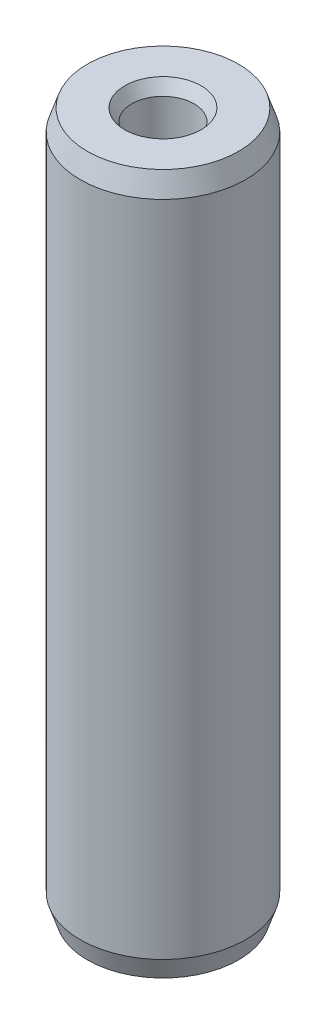
ISO-10303-21;
HEADER;
FILE_DESCRIPTION(('STEP AP214'),'2;1');
FILE_NAME('part.step','',(''),(''),'','','');
FILE_SCHEMA(('AUTOMOTIVE_DESIGN { 1 0 10303 214 1 1 1 1 }'));
ENDSEC;
DATA;
#1=APPLICATION_CONTEXT('core data for automotive mechanical design processes');
#2=APPLICATION_PROTOCOL_DEFINITION('international standard','automotive_design',2000,#1);
#3=PRODUCT_CONTEXT('',#1,'mechanical');
#4=PRODUCT('Part','Part','',(#3));
#5=PRODUCT_RELATED_PRODUCT_CATEGORY('part','',(#4));
#6=PRODUCT_DEFINITION_FORMATION('','',#4);
#7=PRODUCT_DEFINITION_CONTEXT('part definition',#1,'design');
#8=PRODUCT_DEFINITION('design','',#6,#7);
#9=PRODUCT_DEFINITION_SHAPE('','',#8);
#10=(LENGTH_UNIT() NAMED_UNIT(*) SI_UNIT(.MILLI.,.METRE.));
#11=(NAMED_UNIT(*) PLANE_ANGLE_UNIT() SI_UNIT($,.RADIAN.));
#12=(NAMED_UNIT(*) SI_UNIT($,.STERADIAN.) SOLID_ANGLE_UNIT());
#13=UNCERTAINTY_MEASURE_WITH_UNIT(LENGTH_MEASURE(1.E-05),#10,'distance_accuracy_value','');
#14=(GEOMETRIC_REPRESENTATION_CONTEXT(3) GLOBAL_UNCERTAINTY_ASSIGNED_CONTEXT((#13)) GLOBAL_UNIT_ASSIGNED_CONTEXT((#10,
#11,#12)) REPRESENTATION_CONTEXT('',''));
#15=CARTESIAN_POINT('',(0.,0.,0.));
#16=DIRECTION('',(0.,0.,1.));
#17=DIRECTION('',(1.,0.,0.));
#18=AXIS2_PLACEMENT_3D('',#15,#16,#17);
#19=CARTESIAN_POINT('',(-1.06592274227069,15.1859369307251,-1.12643595849704));
#20=DIRECTION('',(0.,-1.,0.));
#21=DIRECTION('',(0.,0.,-1.));
#22=AXIS2_PLACEMENT_3D('',#19,#20,#21);
#23=PLANE('',#22);
#24=CARTESIAN_POINT('',(-1.06592274227069,15.1859369307251,-1.12643595849704));
#25=DIRECTION('',(0.,-1.,0.));
#26=DIRECTION('',(0.,0.,-1.));
#27=AXIS2_PLACEMENT_3D('',#24,#25,#26);
#28=CIRCLE('',#27,1.3843);
#29=CARTESIAN_POINT('',(-1.06592274227069,15.1859369307251,0.257864041502961));
#30=VERTEX_POINT('',#29);
#31=EDGE_CURVE('E11',#30,#30,#28,.T.);
#32=ORIENTED_EDGE('',*,*,#31,.T.);
#33=EDGE_LOOP('',(#32));
#34=FACE_BOUND('',#33,.T.);
#35=CARTESIAN_POINT('',(-1.06592274227069,15.1859369307251,-1.12643595849704));
#36=DIRECTION('',(0.,1.,0.));
#37=DIRECTION('',(0.,0.,1.));
#38=AXIS2_PLACEMENT_3D('',#35,#36,#37);
#39=CIRCLE('',#38,2.7432);
#40=CARTESIAN_POINT('',(-1.06592274227069,15.1859369307251,1.61676404150296));
#41=VERTEX_POINT('',#40);
#42=EDGE_CURVE('E54',#41,#41,#39,.T.);
#43=ORIENTED_EDGE('',*,*,#42,.T.);
#44=EDGE_LOOP('',(#43));
#45=FACE_BOUND('',#44,.T.);
#46=ADVANCED_FACE('F16',(#34,#45),#23,.F.);
#47=CARTESIAN_POINT('',(-1.06592274227069,14.4239369307251,-1.12643595849704));
#48=DIRECTION('',(0.,-1.,0.));
#49=DIRECTION('',(0.,0.,-1.));
#50=AXIS2_PLACEMENT_3D('',#47,#48,#49);
#51=CONICAL_SURFACE('',#50,2.9972,0.321750554396645);
#52=ORIENTED_EDGE('',*,*,#42,.F.);
#53=EDGE_LOOP('',(#52));
#54=FACE_BOUND('',#53,.T.);
#55=CARTESIAN_POINT('',(-1.06592274227069,14.4239369307251,-1.12643595849704));
#56=DIRECTION('',(0.,1.,0.));
#57=DIRECTION('',(0.,0.,1.));
#58=AXIS2_PLACEMENT_3D('',#55,#56,#57);
#59=CIRCLE('',#58,2.9972);
#60=CARTESIAN_POINT('',(-1.06592274227069,14.4239369307251,1.87076404150296));
#61=VERTEX_POINT('',#60);
#62=EDGE_CURVE('E51',#61,#61,#59,.T.);
#63=ORIENTED_EDGE('',*,*,#62,.T.);
#64=EDGE_LOOP('',(#63));
#65=FACE_BOUND('',#64,.T.);
#66=ADVANCED_FACE('F75',(#54,#65),#51,.T.);
#67=CARTESIAN_POINT('',(-1.06592274227069,15.1859369307251,-1.12643595849704));
#68=DIRECTION('',(0.,1.,0.));
#69=DIRECTION('',(0.,0.,1.));
#70=AXIS2_PLACEMENT_3D('',#67,#68,#69);
#71=CYLINDRICAL_SURFACE('',#70,2.9972);
#72=ORIENTED_EDGE('',*,*,#62,.F.);
#73=EDGE_LOOP('',(#72));
#74=FACE_BOUND('',#73,.T.);
#75=CARTESIAN_POINT('',(-1.06592274227069,-9.45206306927492,-1.12643595849704));
#76=DIRECTION('',(0.,1.,0.));
#77=DIRECTION('',(0.,0.,1.));
#78=AXIS2_PLACEMENT_3D('',#75,#76,#77);
#79=CIRCLE('',#78,2.9972);
#80=CARTESIAN_POINT('',(-1.06592274227069,-9.45206306927492,1.87076404150296));
#81=VERTEX_POINT('',#80);
#82=EDGE_CURVE('E48',#81,#81,#79,.T.);
#83=ORIENTED_EDGE('',*,*,#82,.T.);
#84=EDGE_LOOP('',(#83));
#85=FACE_BOUND('',#84,.T.);
#86=ADVANCED_FACE('F81',(#74,#85),#71,.T.);
#87=CARTESIAN_POINT('',(-1.06592274227069,-10.2140630692749,-1.12643595849704));
#88=DIRECTION('',(0.,1.,0.));
#89=DIRECTION('',(0.,0.,1.));
#90=AXIS2_PLACEMENT_3D('',#87,#88,#89);
#91=CONICAL_SURFACE('',#90,2.7432,0.321750554396645);
#92=ORIENTED_EDGE('',*,*,#82,.F.);
#93=EDGE_LOOP('',(#92));
#94=FACE_BOUND('',#93,.T.);
#95=CARTESIAN_POINT('',(-1.06592274227069,-10.2140630692749,-1.12643595849704));
#96=DIRECTION('',(0.,1.,0.));
#97=DIRECTION('',(0.,0.,1.));
#98=AXIS2_PLACEMENT_3D('',#95,#96,#97);
#99=CIRCLE('',#98,2.7432);
#100=CARTESIAN_POINT('',(-1.06592274227069,-10.2140630692749,1.61676404150296));
#101=VERTEX_POINT('',#100);
#102=EDGE_CURVE('E43',#101,#101,#99,.T.);
#103=ORIENTED_EDGE('',*,*,#102,.T.);
#104=EDGE_LOOP('',(#103));
#105=FACE_BOUND('',#104,.T.);
#106=ADVANCED_FACE('F88',(#94,#105),#91,.T.);
#107=CARTESIAN_POINT('',(1.67727725772931,-10.2140630692749,-1.12643595849704));
#108=DIRECTION('',(0.,1.,0.));
#109=DIRECTION('',(0.,0.,1.));
#110=AXIS2_PLACEMENT_3D('',#107,#108,#109);
#111=PLANE('',#110);
#112=CARTESIAN_POINT('',(-1.06592274227069,-10.2140630692749,-1.12643595849704));
#113=DIRECTION('',(0.,1.,0.));
#114=DIRECTION('',(0.,0.,1.));
#115=AXIS2_PLACEMENT_3D('',#112,#113,#114);
#116=CIRCLE('',#115,1.3843);
#117=CARTESIAN_POINT('',(-1.06592274227069,-10.2140630692749,-2.51073595849704));
#118=VERTEX_POINT('',#117);
#119=EDGE_CURVE('E60',#118,#118,#116,.T.);
#120=ORIENTED_EDGE('',*,*,#119,.T.);
#121=EDGE_LOOP('',(#120));
#122=FACE_BOUND('',#121,.T.);
#123=ORIENTED_EDGE('',*,*,#102,.F.);
#124=EDGE_LOOP('',(#123));
#125=FACE_BOUND('',#124,.T.);
#126=ADVANCED_FACE('F92',(#122,#125),#111,.F.);
#127=CARTESIAN_POINT('',(-1.06592274227069,-10.2140630692749,-1.12643595849704));
#128=DIRECTION('',(0.,-1.,0.));
#129=DIRECTION('',(0.,0.,-1.));
#130=AXIS2_PLACEMENT_3D('',#127,#128,#129);
#131=CYLINDRICAL_SURFACE('',#130,1.1303);
#132=CARTESIAN_POINT('',(-1.06592274227069,-9.77412216415243,-1.12643595849704));
#133=DIRECTION('',(0.,1.,0.));
#134=DIRECTION('',(0.,0.,1.));
#135=AXIS2_PLACEMENT_3D('',#132,#133,#134);
#136=CIRCLE('',#135,1.1303);
#137=CARTESIAN_POINT('',(-1.06592274227069,-9.77412216415243,-2.25673595849704));
#138=VERTEX_POINT('',#137);
#139=EDGE_CURVE('E57',#138,#138,#136,.F.);
#140=ORIENTED_EDGE('',*,*,#139,.T.);
#141=EDGE_LOOP('',(#140));
#142=FACE_BOUND('',#141,.T.);
#143=CARTESIAN_POINT('',(-1.06592274227069,-4.49906306927493,-1.12643595849704));
#144=DIRECTION('',(0.,-1.,0.));
#145=DIRECTION('',(0.,0.,-1.));
#146=AXIS2_PLACEMENT_3D('',#143,#144,#145);
#147=CIRCLE('',#146,1.1303);
#148=CARTESIAN_POINT('',(-1.06592274227069,-4.49906306927493,-2.25673595849704));
#149=VERTEX_POINT('',#148);
#150=EDGE_CURVE('E40',#149,#149,#147,.T.);
#151=ORIENTED_EDGE('',*,*,#150,.F.);
#152=EDGE_LOOP('',(#151));
#153=FACE_BOUND('',#152,.T.);
#154=ADVANCED_FACE('F96',(#142,#153),#131,.F.);
#155=CARTESIAN_POINT('',(-1.06592274227069,-4.49906306927493,-1.12643595849704));
#156=DIRECTION('',(0.,-1.,0.));
#157=DIRECTION('',(0.,0.,-1.));
#158=AXIS2_PLACEMENT_3D('',#155,#156,#157);
#159=CONICAL_SURFACE('',#158,1.1303,1.02974425867665);
#160=CARTESIAN_POINT('',(-1.06592274227069,-3.81991031158807,-1.12643595849704));
#161=VERTEX_POINT('',#160);
#162=VERTEX_LOOP('',#161);
#163=FACE_BOUND('',#162,.T.);
#164=ORIENTED_EDGE('',*,*,#150,.T.);
#165=EDGE_LOOP('',(#164));
#166=FACE_BOUND('',#165,.T.);
#167=ADVANCED_FACE('F100',(#163,#166),#159,.F.);
#168=CARTESIAN_POINT('',(-1.06592274227069,15.1859369307251,-1.12643595849704));
#169=DIRECTION('',(0.,1.,0.));
#170=DIRECTION('',(0.,0.,1.));
#171=AXIS2_PLACEMENT_3D('',#168,#169,#170);
#172=CYLINDRICAL_SURFACE('',#171,1.1303);
#173=CARTESIAN_POINT('',(-1.06592274227069,14.7459960256026,-1.12643595849704));
#174=DIRECTION('',(0.,-1.,0.));
#175=DIRECTION('',(0.,0.,-1.));
#176=AXIS2_PLACEMENT_3D('',#173,#174,#175);
#177=CIRCLE('',#176,1.1303);
#178=CARTESIAN_POINT('',(-1.06592274227069,14.7459960256026,0.00386404150295875));
#179=VERTEX_POINT('',#178);
#180=EDGE_CURVE('E24',#179,#179,#177,.F.);
#181=ORIENTED_EDGE('',*,*,#180,.T.);
#182=EDGE_LOOP('',(#181));
#183=FACE_BOUND('',#182,.T.);
#184=CARTESIAN_POINT('',(-1.06592274227069,9.47093693072507,-1.12643595849704));
#185=DIRECTION('',(0.,1.,0.));
#186=DIRECTION('',(0.,0.,1.));
#187=AXIS2_PLACEMENT_3D('',#184,#185,#186);
#188=CIRCLE('',#187,1.1303);
#189=CARTESIAN_POINT('',(-1.06592274227069,9.47093693072507,0.00386404150295766));
#190=VERTEX_POINT('',#189);
#191=EDGE_CURVE('E38',#190,#190,#188,.T.);
#192=ORIENTED_EDGE('',*,*,#191,.F.);
#193=EDGE_LOOP('',(#192));
#194=FACE_BOUND('',#193,.T.);
#195=ADVANCED_FACE('F34',(#183,#194),#172,.F.);
#196=CARTESIAN_POINT('',(-1.06592274227069,9.47093693072507,-1.12643595849704));
#197=DIRECTION('',(0.,1.,0.));
#198=DIRECTION('',(0.,0.,1.));
#199=AXIS2_PLACEMENT_3D('',#196,#197,#198);
#200=CONICAL_SURFACE('',#199,1.1303,1.02974425867665);
#201=CARTESIAN_POINT('',(-1.06592274227069,8.79178417303822,-1.12643595849704));
#202=VERTEX_POINT('',#201);
#203=VERTEX_LOOP('',#202);
#204=FACE_BOUND('',#203,.T.);
#205=ORIENTED_EDGE('',*,*,#191,.T.);
#206=EDGE_LOOP('',(#205));
#207=FACE_BOUND('',#206,.T.);
#208=ADVANCED_FACE('F30',(#204,#207),#200,.F.);
#209=CARTESIAN_POINT('',(-1.06592274227069,-9.77412216415243,-1.12643595849704));
#210=DIRECTION('',(0.,-1.,0.));
#211=DIRECTION('',(0.,0.,-1.));
#212=AXIS2_PLACEMENT_3D('',#209,#210,#211);
#213=CONICAL_SURFACE('',#212,1.1303,0.5235987755983);
#214=CARTESIAN_POINT('',(-1.06592274227069,-10.2140630692749,-2.51073595849704));
#215=CARTESIAN_POINT('',(-1.06592274227069,-10.2094803515132,-2.50809012516371));
#216=CARTESIAN_POINT('',(-1.06592274227069,-10.2048976337515,-2.50544429183038));
#217=CARTESIAN_POINT('',(-1.06592274227069,-10.1957321982282,-2.50015262516371));
#218=CARTESIAN_POINT('',(-1.06592274227069,-10.1911494804665,-2.49750679183038));
#219=CARTESIAN_POINT('',(-1.06592274227069,-10.1819840449431,-2.49221512516371));
#220=CARTESIAN_POINT('',(-1.06592274227069,-10.1774013271814,-2.48956929183038));
#221=CARTESIAN_POINT('',(-1.06592274227069,-10.168235891658,-2.48427762516371));
#222=CARTESIAN_POINT('',(-1.06592274227069,-10.1636531738963,-2.48163179183038));
#223=CARTESIAN_POINT('',(-1.06592274227069,-10.1544877383729,-2.47634012516371));
#224=CARTESIAN_POINT('',(-1.06592274227069,-10.1499050206112,-2.47369429183038));
#225=CARTESIAN_POINT('',(-1.06592274227069,-10.1407395850878,-2.46840262516371));
#226=CARTESIAN_POINT('',(-1.06592274227069,-10.1361568673262,-2.46575679183038));
#227=CARTESIAN_POINT('',(-1.06592274227069,-10.1269914318028,-2.46046512516371));
#228=CARTESIAN_POINT('',(-1.06592274227069,-10.1224087140411,-2.45781929183038));
#229=CARTESIAN_POINT('',(-1.06592274227069,-10.1132432785177,-2.45252762516371));
#230=CARTESIAN_POINT('',(-1.06592274227069,-10.108660560756,-2.44988179183038));
#231=CARTESIAN_POINT('',(-1.06592274227069,-10.0994951252326,-2.44459012516371));
#232=CARTESIAN_POINT('',(-1.06592274227069,-10.0949124074709,-2.44194429183038));
#233=CARTESIAN_POINT('',(-1.06592274227069,-10.0857469719475,-2.43665262516371));
#234=CARTESIAN_POINT('',(-1.06592274227069,-10.0811642541858,-2.43400679183038));
#235=CARTESIAN_POINT('',(-1.06592274227069,-10.0719988186625,-2.42871512516371));
#236=CARTESIAN_POINT('',(-1.06592274227069,-10.0674161009008,-2.42606929183038));
#237=CARTESIAN_POINT('',(-1.06592274227069,-10.0582506653774,-2.42077762516371));
#238=CARTESIAN_POINT('',(-1.06592274227069,-10.0536679476157,-2.41813179183038));
#239=CARTESIAN_POINT('',(-1.06592274227069,-10.0445025120923,-2.41284012516371));
#240=CARTESIAN_POINT('',(-1.06592274227069,-10.0399197943306,-2.41019429183038));
#241=CARTESIAN_POINT('',(-1.06592274227069,-10.0307543588072,-2.40490262516371));
#242=CARTESIAN_POINT('',(-1.06592274227069,-10.0261716410455,-2.40225679183037));
#243=CARTESIAN_POINT('',(-1.06592274227069,-10.0170062055221,-2.39696512516371));
#244=CARTESIAN_POINT('',(-1.06592274227069,-10.0124234877604,-2.39431929183038));
#245=CARTESIAN_POINT('',(-1.06592274227069,-10.0032580522371,-2.38902762516371));
#246=CARTESIAN_POINT('',(-1.06592274227069,-9.99867533447537,-2.38638179183037));
#247=CARTESIAN_POINT('',(-1.06592274227069,-9.98950989895198,-2.38109012516371));
#248=CARTESIAN_POINT('',(-1.06592274227069,-9.98492718119029,-2.37844429183037));
#249=CARTESIAN_POINT('',(-1.06592274227069,-9.97576174566691,-2.37315262516371));
#250=CARTESIAN_POINT('',(-1.06592274227069,-9.97117902790522,-2.37050679183037));
#251=CARTESIAN_POINT('',(-1.06592274227069,-9.96201359238183,-2.36521512516371));
#252=CARTESIAN_POINT('',(-1.06592274227069,-9.95743087462014,-2.36256929183037));
#253=CARTESIAN_POINT('',(-1.06592274227069,-9.94826543909675,-2.35727762516371));
#254=CARTESIAN_POINT('',(-1.06592274227069,-9.94368272133506,-2.35463179183037));
#255=CARTESIAN_POINT('',(-1.06592274227069,-9.93451728581167,-2.34934012516371));
#256=CARTESIAN_POINT('',(-1.06592274227069,-9.92993456804998,-2.34669429183037));
#257=CARTESIAN_POINT('',(-1.06592274227069,-9.92076913252659,-2.34140262516371));
#258=CARTESIAN_POINT('',(-1.06592274227069,-9.9161864147649,-2.33875679183037));
#259=CARTESIAN_POINT('',(-1.06592274227069,-9.90702097924152,-2.33346512516371));
#260=CARTESIAN_POINT('',(-1.06592274227069,-9.90243826147982,-2.33081929183037));
#261=CARTESIAN_POINT('',(-1.06592274227069,-9.89327282595644,-2.32552762516371));
#262=CARTESIAN_POINT('',(-1.06592274227069,-9.88869010819475,-2.32288179183037));
#263=CARTESIAN_POINT('',(-1.06592274227069,-9.87952467267136,-2.31759012516371));
#264=CARTESIAN_POINT('',(-1.06592274227069,-9.87494195490967,-2.31494429183037));
#265=CARTESIAN_POINT('',(-1.06592274227069,-9.86577651938628,-2.30965262516371));
#266=CARTESIAN_POINT('',(-1.06592274227069,-9.86119380162459,-2.30700679183037));
#267=CARTESIAN_POINT('',(-1.06592274227069,-9.8520283661012,-2.30171512516371));
#268=CARTESIAN_POINT('',(-1.06592274227069,-9.84744564833951,-2.29906929183037));
#269=CARTESIAN_POINT('',(-1.06592274227069,-9.83828021281612,-2.29377762516371));
#270=CARTESIAN_POINT('',(-1.06592274227069,-9.83369749505443,-2.29113179183037));
#271=CARTESIAN_POINT('',(-1.06592274227069,-9.82453205953105,-2.28584012516371));
#272=CARTESIAN_POINT('',(-1.06592274227069,-9.81994934176936,-2.28319429183037));
#273=CARTESIAN_POINT('',(-1.06592274227069,-9.81078390624597,-2.27790262516371));
#274=CARTESIAN_POINT('',(-1.06592274227069,-9.80620118848428,-2.27525679183037));
#275=CARTESIAN_POINT('',(-1.06592274227069,-9.79703575296089,-2.26996512516371));
#276=CARTESIAN_POINT('',(-1.06592274227069,-9.7924530351992,-2.26731929183037));
#277=CARTESIAN_POINT('',(-1.06592274227069,-9.78328759967581,-2.26202762516371));
#278=CARTESIAN_POINT('',(-1.06592274227069,-9.77870488191412,-2.25938179183037));
#279=CARTESIAN_POINT('',(-1.06592274227069,-9.77412216415243,-2.25673595849704));
#280=B_SPLINE_CURVE_WITH_KNOTS('',3,(#214,#215,#216,#217,#218,#219,#220,#221,#222,#223,#224,
#225,#226,#227,#228,#229,#230,#231,#232,#233,#234,#235,#236,#237,#238,#239,#240,#241,#242,#243,
#244,#245,#246,#247,#248,#249,#250,#251,#252,#253,#254,#255,#256,#257,#258,#259,#260,#261,#262,
#263,#264,#265,#266,#267,#268,#269,#270,#271,#272,#273,#274,#275,#276,#277,#278,#279),
.UNSPECIFIED.,.F.,.F.,(4,2,2,2,2,2,2,2,2,2,2,2,2,2,2,2,2,2,2,2,2,2,2,2,2,2,2,2,2,2,2,2,4),(0.,
0.0158750000000001,0.0317500000000004,0.0476250000000008,0.0635000000000011,0.0793750000000014,
0.0952500000000018,0.111125000000002,0.127000000000001,0.142875000000001,0.158750000000002,
0.174625000000002,0.190500000000002,0.206375000000002,0.222250000000003,0.238125000000003,
0.254000000000002,0.269875000000002,0.285750000000002,0.301625000000002,0.317500000000003,
0.333375000000003,0.349250000000003,0.365125000000004,0.381000000000004,0.396875000000003,
0.412750000000003,0.428625000000003,0.444500000000004,0.460375000000004,0.476250000000004,
0.492125000000005,0.508000000000005),.UNSPECIFIED.);
#281=EDGE_CURVE('BSEAM33',#118,#138,#280,.T.);
#282=ORIENTED_EDGE('',*,*,#119,.F.);
#283=ORIENTED_EDGE('',*,*,#139,.F.);
#284=ORIENTED_EDGE('',*,*,#281,.T.);
#285=ORIENTED_EDGE('',*,*,#281,.F.);
#286=EDGE_LOOP('',(#282,#284,#283,#285));
#287=FACE_BOUND('',#286,.T.);
#288=ADVANCED_FACE('F33',(#287),#213,.F.);
#289=CARTESIAN_POINT('',(-1.06592274227069,14.7459960256026,-1.12643595849704));
#290=DIRECTION('',(0.,1.,0.));
#291=DIRECTION('',(0.,0.,1.));
#292=AXIS2_PLACEMENT_3D('',#289,#290,#291);
#293=CONICAL_SURFACE('',#292,1.1303,0.5235987755983);
#294=CARTESIAN_POINT('',(-1.06592274227069,15.1859369307251,0.257864041502961));
#295=CARTESIAN_POINT('',(-1.06592274227069,15.1813542129634,0.255218208169628));
#296=CARTESIAN_POINT('',(-1.06592274227069,15.1767714952017,0.252572374836295));
#297=CARTESIAN_POINT('',(-1.06592274227069,15.1676060596783,0.247280708169628));
#298=CARTESIAN_POINT('',(-1.06592274227069,15.1630233419166,0.244634874836295));
#299=CARTESIAN_POINT('',(-1.06592274227069,15.1538579063932,0.239343208169628));
#300=CARTESIAN_POINT('',(-1.06592274227069,15.1492751886315,0.236697374836294));
#301=CARTESIAN_POINT('',(-1.06592274227069,15.1401097531081,0.231405708169628));
#302=CARTESIAN_POINT('',(-1.06592274227069,15.1355270353465,0.228759874836294));
#303=CARTESIAN_POINT('',(-1.06592274227069,15.1263615998231,0.223468208169628));
#304=CARTESIAN_POINT('',(-1.06592274227069,15.1217788820614,0.220822374836294));
#305=CARTESIAN_POINT('',(-1.06592274227069,15.112613446538,0.215530708169628));
#306=CARTESIAN_POINT('',(-1.06592274227069,15.1080307287763,0.212884874836294));
#307=CARTESIAN_POINT('',(-1.06592274227069,15.0988652932529,0.207593208169628));
#308=CARTESIAN_POINT('',(-1.06592274227069,15.0942825754912,0.204947374836294));
#309=CARTESIAN_POINT('',(-1.06592274227069,15.0851171399678,0.199655708169628));
#310=CARTESIAN_POINT('',(-1.06592274227069,15.0805344222061,0.197009874836294));
#311=CARTESIAN_POINT('',(-1.06592274227069,15.0713689866828,0.191718208169627));
#312=CARTESIAN_POINT('',(-1.06592274227069,15.0667862689211,0.189072374836294));
#313=CARTESIAN_POINT('',(-1.06592274227069,15.0576208333977,0.183780708169627));
#314=CARTESIAN_POINT('',(-1.06592274227069,15.053038115636,0.181134874836294));
#315=CARTESIAN_POINT('',(-1.06592274227069,15.0438726801126,0.175843208169627));
#316=CARTESIAN_POINT('',(-1.06592274227069,15.0392899623509,0.173197374836294));
#317=CARTESIAN_POINT('',(-1.06592274227069,15.0301245268275,0.167905708169627));
#318=CARTESIAN_POINT('',(-1.06592274227069,15.0255418090658,0.165259874836294));
#319=CARTESIAN_POINT('',(-1.06592274227069,15.0163763735424,0.159968208169627));
#320=CARTESIAN_POINT('',(-1.06592274227069,15.0117936557808,0.157322374836294));
#321=CARTESIAN_POINT('',(-1.06592274227069,15.0026282202574,0.152030708169627));
#322=CARTESIAN_POINT('',(-1.06592274227069,14.9980455024957,0.149384874836294));
#323=CARTESIAN_POINT('',(-1.06592274227069,14.9888800669723,0.144093208169627));
#324=CARTESIAN_POINT('',(-1.06592274227069,14.9842973492106,0.141447374836294));
#325=CARTESIAN_POINT('',(-1.06592274227069,14.9751319136872,0.136155708169627));
#326=CARTESIAN_POINT('',(-1.06592274227069,14.9705491959255,0.133509874836293));
#327=CARTESIAN_POINT('',(-1.06592274227069,14.9613837604021,0.128218208169627));
#328=CARTESIAN_POINT('',(-1.06592274227069,14.9568010426404,0.125572374836293));
#329=CARTESIAN_POINT('',(-1.06592274227069,14.9476356071171,0.120280708169627));
#330=CARTESIAN_POINT('',(-1.06592274227069,14.9430528893554,0.117634874836293));
#331=CARTESIAN_POINT('',(-1.06592274227069,14.933887453832,0.112343208169627));
#332=CARTESIAN_POINT('',(-1.06592274227069,14.9293047360703,0.109697374836293));
#333=CARTESIAN_POINT('',(-1.06592274227069,14.9201393005469,0.104405708169626));
#334=CARTESIAN_POINT('',(-1.06592274227069,14.9155565827852,0.101759874836293));
#335=CARTESIAN_POINT('',(-1.06592274227069,14.9063911472618,0.0964682081696264));
#336=CARTESIAN_POINT('',(-1.06592274227069,14.9018084295001,0.0938223748362931));
#337=CARTESIAN_POINT('',(-1.06592274227069,14.8926429939767,0.0885307081696264));
#338=CARTESIAN_POINT('',(-1.06592274227069,14.8880602762151,0.085884874836293));
#339=CARTESIAN_POINT('',(-1.06592274227069,14.8788948406917,0.0805932081696262));
#340=CARTESIAN_POINT('',(-1.06592274227069,14.87431212293,0.0779473748362928));
#341=CARTESIAN_POINT('',(-1.06592274227069,14.8651466874066,0.0726557081696262));
#342=CARTESIAN_POINT('',(-1.06592274227069,14.8605639696449,0.0700098748362929));
#343=CARTESIAN_POINT('',(-1.06592274227069,14.8513985341215,0.0647182081696261));
#344=CARTESIAN_POINT('',(-1.06592274227069,14.8468158163598,0.0620723748362927));
#345=CARTESIAN_POINT('',(-1.06592274227069,14.8376503808364,0.056780708169626));
#346=CARTESIAN_POINT('',(-1.06592274227069,14.8330676630747,0.0541348748362927));
#347=CARTESIAN_POINT('',(-1.06592274227069,14.8239022275514,0.048843208169626));
#348=CARTESIAN_POINT('',(-1.06592274227069,14.8193195097897,0.0461973748362926));
#349=CARTESIAN_POINT('',(-1.06592274227069,14.8101540742663,0.0409057081696258));
#350=CARTESIAN_POINT('',(-1.06592274227069,14.8055713565046,0.0382598748362924));
#351=CARTESIAN_POINT('',(-1.06592274227069,14.7964059209812,0.0329682081696257));
#352=CARTESIAN_POINT('',(-1.06592274227069,14.7918232032195,0.0303223748362925));
#353=CARTESIAN_POINT('',(-1.06592274227069,14.7826577676961,0.0250307081696258));
#354=CARTESIAN_POINT('',(-1.06592274227069,14.7780750499344,0.0223848748362924));
#355=CARTESIAN_POINT('',(-1.06592274227069,14.768909614411,0.0170932081696256));
#356=CARTESIAN_POINT('',(-1.06592274227069,14.7643268966493,0.0144473748362923));
#357=CARTESIAN_POINT('',(-1.06592274227069,14.755161461126,0.0091557081696255));
#358=CARTESIAN_POINT('',(-1.06592274227069,14.7505787433643,0.00650987483629213));
#359=CARTESIAN_POINT('',(-1.06592274227069,14.7459960256026,0.00386404150295875));
#360=B_SPLINE_CURVE_WITH_KNOTS('',3,(#294,#295,#296,#297,#298,#299,#300,#301,#302,#303,#304,
#305,#306,#307,#308,#309,#310,#311,#312,#313,#314,#315,#316,#317,#318,#319,#320,#321,#322,#323,
#324,#325,#326,#327,#328,#329,#330,#331,#332,#333,#334,#335,#336,#337,#338,#339,#340,#341,#342,
#343,#344,#345,#346,#347,#348,#349,#350,#351,#352,#353,#354,#355,#356,#357,#358,#359),
.UNSPECIFIED.,.F.,.F.,(4,2,2,2,2,2,2,2,2,2,2,2,2,2,2,2,2,2,2,2,2,2,2,2,2,2,2,2,2,2,2,2,4),(0.,
0.0158750000000002,0.0317500000000005,0.0476250000000009,0.0635000000000011,0.0793750000000014,
0.0952500000000018,0.111125000000002,0.127000000000001,0.142875000000001,0.158750000000001,
0.174625000000002,0.190500000000002,0.206375000000002,0.222250000000003,0.238125000000003,
0.254000000000002,0.269875000000002,0.285750000000002,0.301625000000003,0.317500000000003,
0.333375000000003,0.349250000000003,0.365125000000004,0.381000000000004,0.396875000000003,
0.412750000000003,0.428625000000003,0.444500000000004,0.460375000000004,0.476250000000004,
0.492125000000005,0.508000000000005),.UNSPECIFIED.);
#361=EDGE_CURVE('BSEAM18',#30,#179,#360,.T.);
#362=ORIENTED_EDGE('',*,*,#31,.F.);
#363=ORIENTED_EDGE('',*,*,#180,.F.);
#364=ORIENTED_EDGE('',*,*,#361,.T.);
#365=ORIENTED_EDGE('',*,*,#361,.F.);
#366=EDGE_LOOP('',(#362,#364,#363,#365));
#367=FACE_BOUND('',#366,.T.);
#368=ADVANCED_FACE('F18',(#367),#293,.F.);
#369=CLOSED_SHELL('',(#46,#66,#86,#106,#126,#154,#167,#195,#208,#288,#368));
#370=MANIFOLD_SOLID_BREP('B1',#369);
#371=ADVANCED_BREP_SHAPE_REPRESENTATION('',(#18,#370),#14);
#372=SHAPE_DEFINITION_REPRESENTATION(#9,#371);
ENDSEC;
END-ISO-10303-21;
